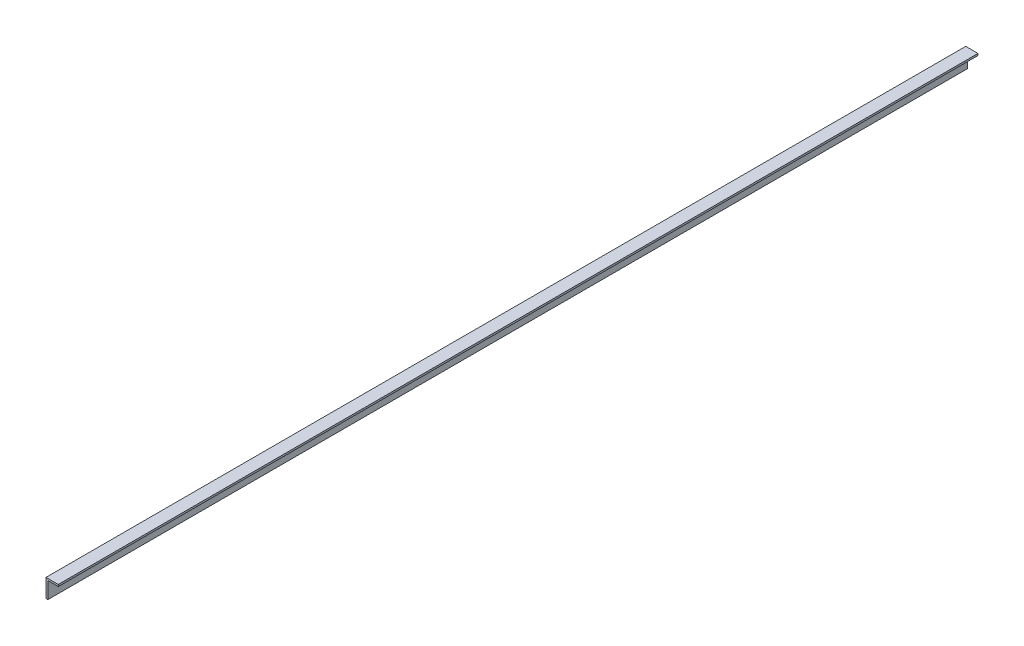
ISO-10303-21;
HEADER;
FILE_DESCRIPTION(('STEP AP214'),'2;1');
FILE_NAME('part.step','',(''),(''),'','','');
FILE_SCHEMA(('AUTOMOTIVE_DESIGN { 1 0 10303 214 1 1 1 1 }'));
ENDSEC;
DATA;
#1=APPLICATION_CONTEXT('core data for automotive mechanical design processes');
#2=APPLICATION_PROTOCOL_DEFINITION('international standard','automotive_design',2000,#1);
#3=PRODUCT_CONTEXT('',#1,'mechanical');
#4=PRODUCT('Part','Part','',(#3));
#5=PRODUCT_RELATED_PRODUCT_CATEGORY('part','',(#4));
#6=PRODUCT_DEFINITION_FORMATION('','',#4);
#7=PRODUCT_DEFINITION_CONTEXT('part definition',#1,'design');
#8=PRODUCT_DEFINITION('design','',#6,#7);
#9=PRODUCT_DEFINITION_SHAPE('','',#8);
#10=(LENGTH_UNIT() NAMED_UNIT(*) SI_UNIT(.MILLI.,.METRE.));
#11=(NAMED_UNIT(*) PLANE_ANGLE_UNIT() SI_UNIT($,.RADIAN.));
#12=(NAMED_UNIT(*) SI_UNIT($,.STERADIAN.) SOLID_ANGLE_UNIT());
#13=UNCERTAINTY_MEASURE_WITH_UNIT(LENGTH_MEASURE(1.E-05),#10,'distance_accuracy_value','');
#14=(GEOMETRIC_REPRESENTATION_CONTEXT(3) GLOBAL_UNCERTAINTY_ASSIGNED_CONTEXT((#13)) GLOBAL_UNIT_ASSIGNED_CONTEXT((#10,
#11,#12)) REPRESENTATION_CONTEXT('',''));
#15=CARTESIAN_POINT('',(0.,0.,0.));
#16=DIRECTION('',(0.,0.,1.));
#17=DIRECTION('',(1.,0.,0.));
#18=AXIS2_PLACEMENT_3D('',#15,#16,#17);
#19=CARTESIAN_POINT('',(3.,0.,1500.));
#20=DIRECTION('',(0.,1.,0.));
#21=DIRECTION('',(-1.,0.,0.));
#22=AXIS2_PLACEMENT_3D('',#19,#20,#21);
#23=PLANE('',#22);
#24=DIRECTION('',(1.,0.,0.));
#25=VECTOR('',#24,1.);
#26=CARTESIAN_POINT('',(3.,0.,0.));
#27=LINE('',#26,#25);
#28=CARTESIAN_POINT('',(0.,0.,0.));
#29=VERTEX_POINT('',#28);
#30=CARTESIAN_POINT('',(3.,0.,0.));
#31=VERTEX_POINT('',#30);
#32=EDGE_CURVE('E117',#29,#31,#27,.T.);
#33=ORIENTED_EDGE('',*,*,#32,.T.);
#34=DIRECTION('',(0.,0.,-1.));
#35=VECTOR('',#34,1.);
#36=CARTESIAN_POINT('',(3.,0.,1500.));
#37=LINE('',#36,#35);
#38=CARTESIAN_POINT('',(3.,0.,1500.));
#39=VERTEX_POINT('',#38);
#40=EDGE_CURVE('E11',#39,#31,#37,.T.);
#41=ORIENTED_EDGE('',*,*,#40,.F.);
#42=DIRECTION('',(1.,0.,0.));
#43=VECTOR('',#42,1.);
#44=CARTESIAN_POINT('',(3.,0.,1500.));
#45=LINE('',#44,#43);
#46=CARTESIAN_POINT('',(0.,0.,1500.));
#47=VERTEX_POINT('',#46);
#48=EDGE_CURVE('E127',#47,#39,#45,.T.);
#49=ORIENTED_EDGE('',*,*,#48,.F.);
#50=DIRECTION('',(0.,0.,-1.));
#51=VECTOR('',#50,1.);
#52=CARTESIAN_POINT('',(0.,0.,1500.));
#53=LINE('',#52,#51);
#54=EDGE_CURVE('E113',#47,#29,#53,.T.);
#55=ORIENTED_EDGE('',*,*,#54,.T.);
#56=EDGE_LOOP('',(#33,#41,#49,#55));
#57=FACE_BOUND('',#56,.T.);
#58=ADVANCED_FACE('F33',(#57),#23,.F.);
#59=CARTESIAN_POINT('',(3.,27.,1500.));
#60=DIRECTION('',(-1.,0.,0.));
#61=DIRECTION('',(0.,-1.,0.));
#62=AXIS2_PLACEMENT_3D('',#59,#60,#61);
#63=PLANE('',#62);
#64=DIRECTION('',(0.,1.,0.));
#65=VECTOR('',#64,1.);
#66=CARTESIAN_POINT('',(3.,27.,0.));
#67=LINE('',#66,#65);
#68=CARTESIAN_POINT('',(3.,27.,0.));
#69=VERTEX_POINT('',#68);
#70=EDGE_CURVE('E120',#31,#69,#67,.T.);
#71=ORIENTED_EDGE('',*,*,#70,.T.);
#72=DIRECTION('',(0.,0.,-1.));
#73=VECTOR('',#72,1.);
#74=CARTESIAN_POINT('',(3.,27.,1500.));
#75=LINE('',#74,#73);
#76=CARTESIAN_POINT('',(3.,27.,1500.));
#77=VERTEX_POINT('',#76);
#78=EDGE_CURVE('E41',#77,#69,#75,.T.);
#79=ORIENTED_EDGE('',*,*,#78,.F.);
#80=DIRECTION('',(0.,1.,0.));
#81=VECTOR('',#80,1.);
#82=CARTESIAN_POINT('',(3.,27.,1500.));
#83=LINE('',#82,#81);
#84=EDGE_CURVE('E86',#39,#77,#83,.T.);
#85=ORIENTED_EDGE('',*,*,#84,.F.);
#86=ORIENTED_EDGE('',*,*,#40,.T.);
#87=EDGE_LOOP('',(#71,#79,#85,#86));
#88=FACE_BOUND('',#87,.T.);
#89=ADVANCED_FACE('F151',(#88),#63,.F.);
#90=CARTESIAN_POINT('',(20.,27.,1500.));
#91=DIRECTION('',(0.,1.,0.));
#92=DIRECTION('',(-1.,0.,0.));
#93=AXIS2_PLACEMENT_3D('',#90,#91,#92);
#94=PLANE('',#93);
#95=DIRECTION('',(1.,0.,0.));
#96=VECTOR('',#95,1.);
#97=CARTESIAN_POINT('',(20.,27.,0.));
#98=LINE('',#97,#96);
#99=CARTESIAN_POINT('',(20.,27.,0.));
#100=VERTEX_POINT('',#99);
#101=EDGE_CURVE('E122',#69,#100,#98,.T.);
#102=ORIENTED_EDGE('',*,*,#101,.T.);
#103=DIRECTION('',(0.,0.,-1.));
#104=VECTOR('',#103,1.);
#105=CARTESIAN_POINT('',(20.,27.,1500.));
#106=LINE('',#105,#104);
#107=CARTESIAN_POINT('',(20.,27.,1500.));
#108=VERTEX_POINT('',#107);
#109=EDGE_CURVE('E108',#108,#100,#106,.T.);
#110=ORIENTED_EDGE('',*,*,#109,.F.);
#111=DIRECTION('',(1.,0.,0.));
#112=VECTOR('',#111,1.);
#113=CARTESIAN_POINT('',(20.,27.,1500.));
#114=LINE('',#113,#112);
#115=EDGE_CURVE('E99',#77,#108,#114,.T.);
#116=ORIENTED_EDGE('',*,*,#115,.F.);
#117=ORIENTED_EDGE('',*,*,#78,.T.);
#118=EDGE_LOOP('',(#102,#110,#116,#117));
#119=FACE_BOUND('',#118,.T.);
#120=ADVANCED_FACE('F133',(#119),#94,.F.);
#121=CARTESIAN_POINT('',(20.,30.,1500.));
#122=DIRECTION('',(-1.,0.,0.));
#123=DIRECTION('',(0.,-1.,0.));
#124=AXIS2_PLACEMENT_3D('',#121,#122,#123);
#125=PLANE('',#124);
#126=DIRECTION('',(0.,1.,0.));
#127=VECTOR('',#126,1.);
#128=CARTESIAN_POINT('',(20.,30.,0.));
#129=LINE('',#128,#127);
#130=CARTESIAN_POINT('',(20.,30.,0.));
#131=VERTEX_POINT('',#130);
#132=EDGE_CURVE('E107',#100,#131,#129,.T.);
#133=ORIENTED_EDGE('',*,*,#132,.T.);
#134=DIRECTION('',(0.,0.,-1.));
#135=VECTOR('',#134,1.);
#136=CARTESIAN_POINT('',(20.,30.,1500.));
#137=LINE('',#136,#135);
#138=CARTESIAN_POINT('',(20.,30.,1500.));
#139=VERTEX_POINT('',#138);
#140=EDGE_CURVE('E104',#139,#131,#137,.T.);
#141=ORIENTED_EDGE('',*,*,#140,.F.);
#142=DIRECTION('',(0.,1.,0.));
#143=VECTOR('',#142,1.);
#144=CARTESIAN_POINT('',(20.,30.,1500.));
#145=LINE('',#144,#143);
#146=EDGE_CURVE('E93',#108,#139,#145,.T.);
#147=ORIENTED_EDGE('',*,*,#146,.F.);
#148=ORIENTED_EDGE('',*,*,#109,.T.);
#149=EDGE_LOOP('',(#133,#141,#147,#148));
#150=FACE_BOUND('',#149,.T.);
#151=ADVANCED_FACE('F105',(#150),#125,.F.);
#152=CARTESIAN_POINT('',(0.,30.,1500.));
#153=DIRECTION('',(0.,-1.,0.));
#154=DIRECTION('',(0.,0.,-1.));
#155=AXIS2_PLACEMENT_3D('',#152,#153,#154);
#156=PLANE('',#155);
#157=DIRECTION('',(-1.,0.,0.));
#158=VECTOR('',#157,1.);
#159=CARTESIAN_POINT('',(0.,30.,0.));
#160=LINE('',#159,#158);
#161=CARTESIAN_POINT('',(0.,30.,0.));
#162=VERTEX_POINT('',#161);
#163=EDGE_CURVE('E72',#131,#162,#160,.T.);
#164=ORIENTED_EDGE('',*,*,#163,.T.);
#165=DIRECTION('',(0.,0.,-1.));
#166=VECTOR('',#165,1.);
#167=CARTESIAN_POINT('',(0.,30.,1500.));
#168=LINE('',#167,#166);
#169=CARTESIAN_POINT('',(0.,30.,1500.));
#170=VERTEX_POINT('',#169);
#171=EDGE_CURVE('E109',#170,#162,#168,.T.);
#172=ORIENTED_EDGE('',*,*,#171,.F.);
#173=DIRECTION('',(-1.,0.,0.));
#174=VECTOR('',#173,1.);
#175=CARTESIAN_POINT('',(0.,30.,1500.));
#176=LINE('',#175,#174);
#177=EDGE_CURVE('E97',#139,#170,#176,.T.);
#178=ORIENTED_EDGE('',*,*,#177,.F.);
#179=ORIENTED_EDGE('',*,*,#140,.T.);
#180=EDGE_LOOP('',(#164,#172,#178,#179));
#181=FACE_BOUND('',#180,.T.);
#182=ADVANCED_FACE('F111',(#181),#156,.F.);
#183=CARTESIAN_POINT('',(0.,0.,1500.));
#184=DIRECTION('',(1.,0.,0.));
#185=DIRECTION('',(0.,0.,-1.));
#186=AXIS2_PLACEMENT_3D('',#183,#184,#185);
#187=PLANE('',#186);
#188=DIRECTION('',(0.,-1.,0.));
#189=VECTOR('',#188,1.);
#190=CARTESIAN_POINT('',(0.,0.,0.));
#191=LINE('',#190,#189);
#192=EDGE_CURVE('E78',#162,#29,#191,.T.);
#193=ORIENTED_EDGE('',*,*,#192,.T.);
#194=ORIENTED_EDGE('',*,*,#54,.F.);
#195=DIRECTION('',(0.,-1.,0.));
#196=VECTOR('',#195,1.);
#197=CARTESIAN_POINT('',(0.,0.,1500.));
#198=LINE('',#197,#196);
#199=EDGE_CURVE('E49',#170,#47,#198,.T.);
#200=ORIENTED_EDGE('',*,*,#199,.F.);
#201=ORIENTED_EDGE('',*,*,#171,.T.);
#202=EDGE_LOOP('',(#193,#194,#200,#201));
#203=FACE_BOUND('',#202,.T.);
#204=ADVANCED_FACE('F140',(#203),#187,.F.);
#205=CARTESIAN_POINT('',(0.,0.,1500.));
#206=DIRECTION('',(0.,0.,-1.));
#207=DIRECTION('',(-1.,0.,0.));
#208=AXIS2_PLACEMENT_3D('',#205,#206,#207);
#209=PLANE('',#208);
#210=ORIENTED_EDGE('',*,*,#48,.T.);
#211=ORIENTED_EDGE('',*,*,#84,.T.);
#212=ORIENTED_EDGE('',*,*,#115,.T.);
#213=ORIENTED_EDGE('',*,*,#146,.T.);
#214=ORIENTED_EDGE('',*,*,#177,.T.);
#215=ORIENTED_EDGE('',*,*,#199,.T.);
#216=EDGE_LOOP('',(#210,#211,#212,#213,#214,#215));
#217=FACE_BOUND('',#216,.T.);
#218=ADVANCED_FACE('F95',(#217),#209,.F.);
#219=CARTESIAN_POINT('',(0.,0.,0.));
#220=DIRECTION('',(0.,0.,-1.));
#221=DIRECTION('',(-1.,0.,0.));
#222=AXIS2_PLACEMENT_3D('',#219,#220,#221);
#223=PLANE('',#222);
#224=ORIENTED_EDGE('',*,*,#32,.F.);
#225=ORIENTED_EDGE('',*,*,#192,.F.);
#226=ORIENTED_EDGE('',*,*,#163,.F.);
#227=ORIENTED_EDGE('',*,*,#132,.F.);
#228=ORIENTED_EDGE('',*,*,#101,.F.);
#229=ORIENTED_EDGE('',*,*,#70,.F.);
#230=EDGE_LOOP('',(#224,#225,#226,#227,#228,#229));
#231=FACE_BOUND('',#230,.T.);
#232=ADVANCED_FACE('F136',(#231),#223,.T.);
#233=CLOSED_SHELL('',(#58,#89,#120,#151,#182,#204,#218,#232));
#234=MANIFOLD_SOLID_BREP('B2',#233);
#235=ADVANCED_BREP_SHAPE_REPRESENTATION('',(#18,#234),#14);
#236=SHAPE_DEFINITION_REPRESENTATION(#9,#235);
ENDSEC;
END-ISO-10303-21;
